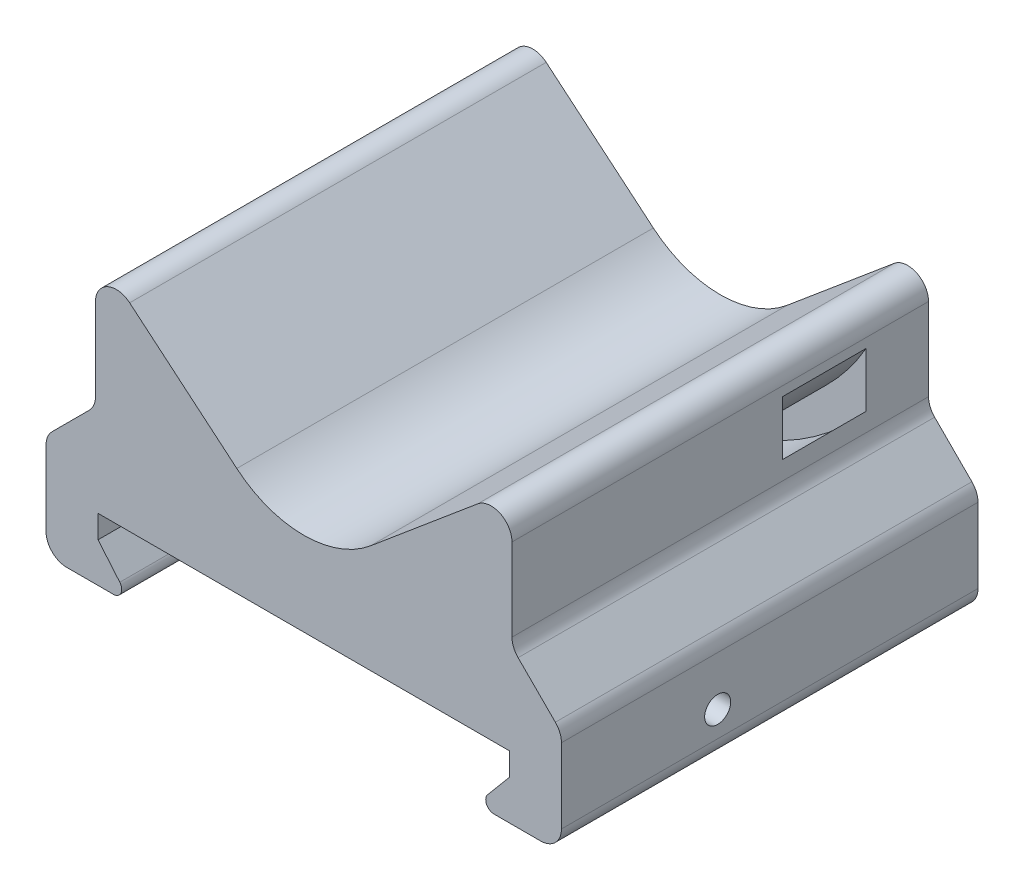
ISO-10303-21;
HEADER;
FILE_DESCRIPTION(('STEP AP214'),'2;1');
FILE_NAME('part.step','',(''),(''),'','','');
FILE_SCHEMA(('AUTOMOTIVE_DESIGN { 1 0 10303 214 1 1 1 1 }'));
ENDSEC;
DATA;
#1=APPLICATION_CONTEXT('core data for automotive mechanical design processes');
#2=APPLICATION_PROTOCOL_DEFINITION('international standard','automotive_design',2000,#1);
#3=PRODUCT_CONTEXT('',#1,'mechanical');
#4=PRODUCT('Part','Part','',(#3));
#5=PRODUCT_RELATED_PRODUCT_CATEGORY('part','',(#4));
#6=PRODUCT_DEFINITION_FORMATION('','',#4);
#7=PRODUCT_DEFINITION_CONTEXT('part definition',#1,'design');
#8=PRODUCT_DEFINITION('design','',#6,#7);
#9=PRODUCT_DEFINITION_SHAPE('','',#8);
#10=(LENGTH_UNIT() NAMED_UNIT(*) SI_UNIT(.MILLI.,.METRE.));
#11=(NAMED_UNIT(*) PLANE_ANGLE_UNIT() SI_UNIT($,.RADIAN.));
#12=(NAMED_UNIT(*) SI_UNIT($,.STERADIAN.) SOLID_ANGLE_UNIT());
#13=UNCERTAINTY_MEASURE_WITH_UNIT(LENGTH_MEASURE(1.E-05),#10,'distance_accuracy_value','');
#14=(GEOMETRIC_REPRESENTATION_CONTEXT(3) GLOBAL_UNCERTAINTY_ASSIGNED_CONTEXT((#13)) GLOBAL_UNIT_ASSIGNED_CONTEXT((#10,
#11,#12)) REPRESENTATION_CONTEXT('',''));
#15=CARTESIAN_POINT('',(0.,0.,0.));
#16=DIRECTION('',(0.,0.,1.));
#17=DIRECTION('',(1.,0.,0.));
#18=AXIS2_PLACEMENT_3D('',#15,#16,#17);
#19=CARTESIAN_POINT('',(-24.75,3.1715728752538,40.));
#20=DIRECTION('',(1.,0.,0.));
#21=DIRECTION('',(0.,1.,0.));
#22=AXIS2_PLACEMENT_3D('',#19,#20,#21);
#23=PLANE('',#22);
#24=DIRECTION('',(0.,-1.,0.));
#25=VECTOR('',#24,1.);
#26=CARTESIAN_POINT('',(-24.75,3.1715728752538,0.));
#27=LINE('',#26,#25);
#28=CARTESIAN_POINT('',(-24.75,3.1715728752538,0.));
#29=VERTEX_POINT('',#28);
#30=CARTESIAN_POINT('',(-24.75,-4.00000000000001,0.));
#31=VERTEX_POINT('',#30);
#32=EDGE_CURVE('E468',#29,#31,#27,.T.);
#33=ORIENTED_EDGE('',*,*,#32,.T.);
#34=DIRECTION('',(0.,0.,-1.));
#35=VECTOR('',#34,1.);
#36=CARTESIAN_POINT('',(-24.75,-4.00000000000001,40.));
#37=LINE('',#36,#35);
#38=CARTESIAN_POINT('',(-24.75,-4.00000000000001,40.));
#39=VERTEX_POINT('',#38);
#40=EDGE_CURVE('E272',#39,#31,#37,.T.);
#41=ORIENTED_EDGE('',*,*,#40,.F.);
#42=DIRECTION('',(0.,-1.,0.));
#43=VECTOR('',#42,1.);
#44=CARTESIAN_POINT('',(-24.75,3.1715728752538,40.));
#45=LINE('',#44,#43);
#46=CARTESIAN_POINT('',(-24.75,3.1715728752538,40.));
#47=VERTEX_POINT('',#46);
#48=EDGE_CURVE('E416',#47,#39,#45,.T.);
#49=ORIENTED_EDGE('',*,*,#48,.F.);
#50=DIRECTION('',(0.,0.,-1.));
#51=VECTOR('',#50,1.);
#52=CARTESIAN_POINT('',(-24.75,3.1715728752538,40.));
#53=LINE('',#52,#51);
#54=EDGE_CURVE('E275',#47,#29,#53,.T.);
#55=ORIENTED_EDGE('',*,*,#54,.T.);
#56=EDGE_LOOP('',(#33,#41,#49,#55));
#57=FACE_BOUND('',#56,.T.);
#58=CARTESIAN_POINT('',(-24.75,-1.55554057263178,25.));
#59=DIRECTION('',(-1.,0.,0.));
#60=DIRECTION('',(0.,0.,1.));
#61=AXIS2_PLACEMENT_3D('',#58,#59,#60);
#62=CIRCLE('',#61,1.525);
#63=CARTESIAN_POINT('',(-24.75,-1.55554057263178,26.525));
#64=VERTEX_POINT('',#63);
#65=EDGE_CURVE('E844',#64,#64,#62,.T.);
#66=ORIENTED_EDGE('',*,*,#65,.F.);
#67=EDGE_LOOP('',(#66));
#68=FACE_BOUND('',#67,.T.);
#69=ADVANCED_FACE('F35',(#57,#68),#23,.F.);
#70=CARTESIAN_POINT('',(19.75,-2.2,40.));
#71=DIRECTION('',(1.,0.,0.));
#72=DIRECTION('',(0.,0.,-1.));
#73=AXIS2_PLACEMENT_3D('',#70,#71,#72);
#74=PLANE('',#73);
#75=DIRECTION('',(0.,0.,-1.));
#76=VECTOR('',#75,1.);
#77=CARTESIAN_POINT('',(19.75,-2.2,40.));
#78=LINE('',#77,#76);
#79=CARTESIAN_POINT('',(19.75,-2.2,23.9289388222533));
#80=VERTEX_POINT('',#79);
#81=CARTESIAN_POINT('',(19.75,-2.2,0.));
#82=VERTEX_POINT('',#81);
#83=EDGE_CURVE('E329',#80,#82,#78,.T.);
#84=ORIENTED_EDGE('',*,*,#83,.F.);
#85=CARTESIAN_POINT('',(19.75,-1.55554057263178,25.));
#86=DIRECTION('',(1.,0.,0.));
#87=DIRECTION('',(0.,0.,-1.));
#88=AXIS2_PLACEMENT_3D('',#85,#86,#87);
#89=CIRCLE('',#88,1.24999999999999);
#90=CARTESIAN_POINT('',(19.75,-2.2,26.0710611777467));
#91=VERTEX_POINT('',#90);
#92=EDGE_CURVE('E49',#80,#91,#89,.T.);
#93=ORIENTED_EDGE('',*,*,#92,.T.);
#94=CARTESIAN_POINT('',(19.75,-2.2,40.));
#95=VERTEX_POINT('',#94);
#96=EDGE_CURVE('E330',#95,#91,#78,.T.);
#97=ORIENTED_EDGE('',*,*,#96,.F.);
#98=DIRECTION('',(0.,-1.,0.));
#99=VECTOR('',#98,1.);
#100=CARTESIAN_POINT('',(19.75,-2.2,40.));
#101=LINE('',#100,#99);
#102=CARTESIAN_POINT('',(19.75,0.,40.));
#103=VERTEX_POINT('',#102);
#104=EDGE_CURVE('E376',#103,#95,#101,.T.);
#105=ORIENTED_EDGE('',*,*,#104,.F.);
#106=DIRECTION('',(0.,0.,-1.));
#107=VECTOR('',#106,1.);
#108=CARTESIAN_POINT('',(19.75,0.,40.));
#109=LINE('',#108,#107);
#110=CARTESIAN_POINT('',(19.75,0.,0.));
#111=VERTEX_POINT('',#110);
#112=EDGE_CURVE('E429',#103,#111,#109,.T.);
#113=ORIENTED_EDGE('',*,*,#112,.T.);
#114=DIRECTION('',(0.,-1.,0.));
#115=VECTOR('',#114,1.);
#116=CARTESIAN_POINT('',(19.75,-2.2,0.));
#117=LINE('',#116,#115);
#118=EDGE_CURVE('E375',#111,#82,#117,.T.);
#119=ORIENTED_EDGE('',*,*,#118,.T.);
#120=EDGE_LOOP('',(#84,#93,#97,#105,#113,#119));
#121=FACE_BOUND('',#120,.T.);
#122=ADVANCED_FACE('F37',(#121),#74,.F.);
#123=CARTESIAN_POINT('',(17.6641913834388,-4.68576991225076,40.));
#124=DIRECTION('',(0.766044443118974,-0.642787609686544,0.));
#125=DIRECTION('',(0.642787609686544,0.766044443118974,0.));
#126=AXIS2_PLACEMENT_3D('',#123,#124,#125);
#127=PLANE('',#126);
#128=ORIENTED_EDGE('',*,*,#96,.T.);
#129=CARTESIAN_POINT('',(20.2907656678134,-1.55554057263178,25.));
#130=DIRECTION('',(0.766044443118974,-0.642787609686544,0.));
#131=DIRECTION('',(-0.642787609686544,-0.766044443118974,0.));
#132=AXIS2_PLACEMENT_3D('',#129,#130,#131);
#133=ELLIPSE('',#132,1.63175911166534,1.24999999999999);
#134=EDGE_CURVE('E252',#91,#80,#133,.T.);
#135=ORIENTED_EDGE('',*,*,#134,.T.);
#136=ORIENTED_EDGE('',*,*,#83,.T.);
#137=DIRECTION('',(-0.642787609686544,-0.766044443118974,0.));
#138=VECTOR('',#137,1.);
#139=CARTESIAN_POINT('',(17.6641913834388,-4.68576991225076,0.));
#140=LINE('',#139,#138);
#141=CARTESIAN_POINT('',(17.6641913834388,-4.68576991225076,0.));
#142=VERTEX_POINT('',#141);
#143=EDGE_CURVE('E432',#82,#142,#140,.T.);
#144=ORIENTED_EDGE('',*,*,#143,.T.);
#145=DIRECTION('',(0.,0.,-1.));
#146=VECTOR('',#145,1.);
#147=CARTESIAN_POINT('',(17.6641913834388,-4.68576991225076,40.));
#148=LINE('',#147,#146);
#149=CARTESIAN_POINT('',(17.6641913834388,-4.68576991225076,40.));
#150=VERTEX_POINT('',#149);
#151=EDGE_CURVE('E326',#150,#142,#148,.T.);
#152=ORIENTED_EDGE('',*,*,#151,.F.);
#153=DIRECTION('',(-0.642787609686544,-0.766044443118974,0.));
#154=VECTOR('',#153,1.);
#155=CARTESIAN_POINT('',(17.6641913834388,-4.68576991225076,40.));
#156=LINE('',#155,#154);
#157=EDGE_CURVE('E379',#95,#150,#156,.T.);
#158=ORIENTED_EDGE('',*,*,#157,.F.);
#159=EDGE_LOOP('',(#128,#135,#136,#144,#152,#158));
#160=FACE_BOUND('',#159,.T.);
#161=ADVANCED_FACE('F499',(#160),#127,.F.);
#162=CARTESIAN_POINT('',(18.277026937934,-5.2,40.));
#163=DIRECTION('',(0.,0.,-1.));
#164=DIRECTION('',(-1.,0.,0.));
#165=AXIS2_PLACEMENT_3D('',#162,#163,#164);
#166=CYLINDRICAL_SURFACE('',#165,0.800000000000002);
#167=CARTESIAN_POINT('',(18.277026937934,-5.2,0.));
#168=DIRECTION('',(0.,0.,1.));
#169=DIRECTION('',(-1.,0.,0.));
#170=AXIS2_PLACEMENT_3D('',#167,#168,#169);
#171=CIRCLE('',#170,0.800000000000002);
#172=CARTESIAN_POINT('',(18.277026937934,-6.,0.));
#173=VERTEX_POINT('',#172);
#174=EDGE_CURVE('E434',#142,#173,#171,.T.);
#175=ORIENTED_EDGE('',*,*,#174,.T.);
#176=DIRECTION('',(0.,0.,-1.));
#177=VECTOR('',#176,1.);
#178=CARTESIAN_POINT('',(18.277026937934,-6.,40.));
#179=LINE('',#178,#177);
#180=CARTESIAN_POINT('',(18.277026937934,-6.,40.));
#181=VERTEX_POINT('',#180);
#182=EDGE_CURVE('E323',#181,#173,#179,.T.);
#183=ORIENTED_EDGE('',*,*,#182,.F.);
#184=CARTESIAN_POINT('',(18.277026937934,-5.2,40.));
#185=DIRECTION('',(0.,0.,1.));
#186=DIRECTION('',(-1.,0.,0.));
#187=AXIS2_PLACEMENT_3D('',#184,#185,#186);
#188=CIRCLE('',#187,0.800000000000002);
#189=EDGE_CURVE('E382',#150,#181,#188,.T.);
#190=ORIENTED_EDGE('',*,*,#189,.F.);
#191=ORIENTED_EDGE('',*,*,#151,.T.);
#192=EDGE_LOOP('',(#175,#183,#190,#191));
#193=FACE_BOUND('',#192,.T.);
#194=ADVANCED_FACE('F595',(#193),#166,.T.);
#195=CARTESIAN_POINT('',(22.75,-6.,40.));
#196=DIRECTION('',(0.,1.,0.));
#197=DIRECTION('',(-1.,0.,0.));
#198=AXIS2_PLACEMENT_3D('',#195,#196,#197);
#199=PLANE('',#198);
#200=DIRECTION('',(1.,0.,0.));
#201=VECTOR('',#200,1.);
#202=CARTESIAN_POINT('',(22.75,-6.,0.));
#203=LINE('',#202,#201);
#204=CARTESIAN_POINT('',(22.75,-6.,0.));
#205=VERTEX_POINT('',#204);
#206=EDGE_CURVE('E436',#173,#205,#203,.T.);
#207=ORIENTED_EDGE('',*,*,#206,.T.);
#208=DIRECTION('',(0.,0.,-1.));
#209=VECTOR('',#208,1.);
#210=CARTESIAN_POINT('',(22.75,-6.,40.));
#211=LINE('',#210,#209);
#212=CARTESIAN_POINT('',(22.75,-6.,40.));
#213=VERTEX_POINT('',#212);
#214=EDGE_CURVE('E320',#213,#205,#211,.T.);
#215=ORIENTED_EDGE('',*,*,#214,.F.);
#216=DIRECTION('',(1.,0.,0.));
#217=VECTOR('',#216,1.);
#218=CARTESIAN_POINT('',(22.75,-6.,40.));
#219=LINE('',#218,#217);
#220=EDGE_CURVE('E384',#181,#213,#219,.T.);
#221=ORIENTED_EDGE('',*,*,#220,.F.);
#222=ORIENTED_EDGE('',*,*,#182,.T.);
#223=EDGE_LOOP('',(#207,#215,#221,#222));
#224=FACE_BOUND('',#223,.T.);
#225=ADVANCED_FACE('F591',(#224),#199,.F.);
#226=CARTESIAN_POINT('',(22.75,-4.,40.));
#227=DIRECTION('',(0.,0.,-1.));
#228=DIRECTION('',(-1.,0.,0.));
#229=AXIS2_PLACEMENT_3D('',#226,#227,#228);
#230=CYLINDRICAL_SURFACE('',#229,2.);
#231=CARTESIAN_POINT('',(22.75,-4.,0.));
#232=DIRECTION('',(0.,0.,1.));
#233=DIRECTION('',(-1.,0.,0.));
#234=AXIS2_PLACEMENT_3D('',#231,#232,#233);
#235=CIRCLE('',#234,2.);
#236=CARTESIAN_POINT('',(24.75,-4.,0.));
#237=VERTEX_POINT('',#236);
#238=EDGE_CURVE('E438',#205,#237,#235,.T.);
#239=ORIENTED_EDGE('',*,*,#238,.T.);
#240=DIRECTION('',(0.,0.,-1.));
#241=VECTOR('',#240,1.);
#242=CARTESIAN_POINT('',(24.75,-4.,40.));
#243=LINE('',#242,#241);
#244=CARTESIAN_POINT('',(24.75,-4.,40.));
#245=VERTEX_POINT('',#244);
#246=EDGE_CURVE('E317',#245,#237,#243,.T.);
#247=ORIENTED_EDGE('',*,*,#246,.F.);
#248=CARTESIAN_POINT('',(22.75,-4.,40.));
#249=DIRECTION('',(0.,0.,1.));
#250=DIRECTION('',(-1.,0.,0.));
#251=AXIS2_PLACEMENT_3D('',#248,#249,#250);
#252=CIRCLE('',#251,2.);
#253=EDGE_CURVE('E386',#213,#245,#252,.T.);
#254=ORIENTED_EDGE('',*,*,#253,.F.);
#255=ORIENTED_EDGE('',*,*,#214,.T.);
#256=EDGE_LOOP('',(#239,#247,#254,#255));
#257=FACE_BOUND('',#256,.T.);
#258=ADVANCED_FACE('F587',(#257),#230,.T.);
#259=CARTESIAN_POINT('',(24.75,3.17157287525381,40.));
#260=DIRECTION('',(-1.,0.,0.));
#261=DIRECTION('',(0.,-1.,0.));
#262=AXIS2_PLACEMENT_3D('',#259,#260,#261);
#263=PLANE('',#262);
#264=CARTESIAN_POINT('',(24.75,-1.55554057263178,25.));
#265=DIRECTION('',(-1.,0.,0.));
#266=DIRECTION('',(0.,0.,1.));
#267=AXIS2_PLACEMENT_3D('',#264,#265,#266);
#268=CIRCLE('',#267,1.24999999999999);
#269=CARTESIAN_POINT('',(24.75,-1.55554057263178,26.25));
#270=VERTEX_POINT('',#269);
#271=EDGE_CURVE('E253',#270,#270,#268,.T.);
#272=ORIENTED_EDGE('',*,*,#271,.T.);
#273=EDGE_LOOP('',(#272));
#274=FACE_BOUND('',#273,.T.);
#275=DIRECTION('',(0.,1.,0.));
#276=VECTOR('',#275,1.);
#277=CARTESIAN_POINT('',(24.75,3.17157287525381,0.));
#278=LINE('',#277,#276);
#279=CARTESIAN_POINT('',(24.75,3.17157287525381,0.));
#280=VERTEX_POINT('',#279);
#281=EDGE_CURVE('E440',#237,#280,#278,.T.);
#282=ORIENTED_EDGE('',*,*,#281,.T.);
#283=DIRECTION('',(0.,0.,-1.));
#284=VECTOR('',#283,1.);
#285=CARTESIAN_POINT('',(24.75,3.17157287525381,40.));
#286=LINE('',#285,#284);
#287=CARTESIAN_POINT('',(24.75,3.17157287525381,40.));
#288=VERTEX_POINT('',#287);
#289=EDGE_CURVE('E314',#288,#280,#286,.T.);
#290=ORIENTED_EDGE('',*,*,#289,.F.);
#291=DIRECTION('',(0.,1.,0.));
#292=VECTOR('',#291,1.);
#293=CARTESIAN_POINT('',(24.75,3.17157287525381,40.));
#294=LINE('',#293,#292);
#295=EDGE_CURVE('E388',#245,#288,#294,.T.);
#296=ORIENTED_EDGE('',*,*,#295,.F.);
#297=ORIENTED_EDGE('',*,*,#246,.T.);
#298=EDGE_LOOP('',(#282,#290,#296,#297));
#299=FACE_BOUND('',#298,.T.);
#300=ADVANCED_FACE('F583',(#274,#299),#263,.F.);
#301=CARTESIAN_POINT('',(22.75,3.17157287525381,40.));
#302=DIRECTION('',(0.,0.,-1.));
#303=DIRECTION('',(-1.,0.,0.));
#304=AXIS2_PLACEMENT_3D('',#301,#302,#303);
#305=CYLINDRICAL_SURFACE('',#304,2.);
#306=CARTESIAN_POINT('',(22.75,3.17157287525381,0.));
#307=DIRECTION('',(0.,0.,1.));
#308=DIRECTION('',(-1.,0.,0.));
#309=AXIS2_PLACEMENT_3D('',#306,#307,#308);
#310=CIRCLE('',#309,2.);
#311=CARTESIAN_POINT('',(24.1642135623731,4.58578643762691,0.));
#312=VERTEX_POINT('',#311);
#313=EDGE_CURVE('E442',#280,#312,#310,.T.);
#314=ORIENTED_EDGE('',*,*,#313,.T.);
#315=DIRECTION('',(0.,0.,-1.));
#316=VECTOR('',#315,1.);
#317=CARTESIAN_POINT('',(24.1642135623731,4.58578643762691,40.));
#318=LINE('',#317,#316);
#319=CARTESIAN_POINT('',(24.1642135623731,4.58578643762691,40.));
#320=VERTEX_POINT('',#319);
#321=EDGE_CURVE('E311',#320,#312,#318,.T.);
#322=ORIENTED_EDGE('',*,*,#321,.F.);
#323=CARTESIAN_POINT('',(22.75,3.17157287525381,40.));
#324=DIRECTION('',(0.,0.,1.));
#325=DIRECTION('',(-1.,0.,0.));
#326=AXIS2_PLACEMENT_3D('',#323,#324,#325);
#327=CIRCLE('',#326,2.);
#328=EDGE_CURVE('E390',#288,#320,#327,.T.);
#329=ORIENTED_EDGE('',*,*,#328,.F.);
#330=ORIENTED_EDGE('',*,*,#289,.T.);
#331=EDGE_LOOP('',(#314,#322,#329,#330));
#332=FACE_BOUND('',#331,.T.);
#333=ADVANCED_FACE('F579',(#332),#305,.T.);
#334=CARTESIAN_POINT('',(20.5857864376269,8.16421356237308,40.));
#335=DIRECTION('',(-0.707106781186546,-0.70710678118655,0.));
#336=DIRECTION('',(0.70710678118655,-0.707106781186546,0.));
#337=AXIS2_PLACEMENT_3D('',#334,#335,#336);
#338=PLANE('',#337);
#339=DIRECTION('',(-0.707106781186549,0.707106781186545,0.));
#340=VECTOR('',#339,1.);
#341=CARTESIAN_POINT('',(20.5857864376269,8.16421356237308,0.));
#342=LINE('',#341,#340);
#343=CARTESIAN_POINT('',(20.5857864376269,8.16421356237308,0.));
#344=VERTEX_POINT('',#343);
#345=EDGE_CURVE('E444',#312,#344,#342,.T.);
#346=ORIENTED_EDGE('',*,*,#345,.T.);
#347=DIRECTION('',(0.,0.,-1.));
#348=VECTOR('',#347,1.);
#349=CARTESIAN_POINT('',(20.5857864376269,8.16421356237308,40.));
#350=LINE('',#349,#348);
#351=CARTESIAN_POINT('',(20.5857864376269,8.16421356237308,40.));
#352=VERTEX_POINT('',#351);
#353=EDGE_CURVE('E308',#352,#344,#350,.T.);
#354=ORIENTED_EDGE('',*,*,#353,.F.);
#355=DIRECTION('',(-0.707106781186549,0.707106781186545,0.));
#356=VECTOR('',#355,1.);
#357=CARTESIAN_POINT('',(20.5857864376269,8.16421356237308,40.));
#358=LINE('',#357,#356);
#359=EDGE_CURVE('E392',#320,#352,#358,.T.);
#360=ORIENTED_EDGE('',*,*,#359,.F.);
#361=ORIENTED_EDGE('',*,*,#321,.T.);
#362=EDGE_LOOP('',(#346,#354,#360,#361));
#363=FACE_BOUND('',#362,.T.);
#364=ADVANCED_FACE('F575',(#363),#338,.F.);
#365=CARTESIAN_POINT('',(22.,9.57842712474618,40.));
#366=DIRECTION('',(0.,0.,-1.));
#367=DIRECTION('',(-1.,0.,0.));
#368=AXIS2_PLACEMENT_3D('',#365,#366,#367);
#369=CYLINDRICAL_SURFACE('',#368,2.);
#370=CARTESIAN_POINT('',(22.,9.57842712474618,0.));
#371=DIRECTION('',(0.,0.,-1.));
#372=DIRECTION('',(1.,0.,0.));
#373=AXIS2_PLACEMENT_3D('',#370,#371,#372);
#374=CIRCLE('',#373,2.);
#375=CARTESIAN_POINT('',(20.,9.57842712474618,0.));
#376=VERTEX_POINT('',#375);
#377=EDGE_CURVE('E446',#344,#376,#374,.T.);
#378=ORIENTED_EDGE('',*,*,#377,.T.);
#379=DIRECTION('',(0.,0.,-1.));
#380=VECTOR('',#379,1.);
#381=CARTESIAN_POINT('',(20.,9.57842712474618,40.));
#382=LINE('',#381,#380);
#383=CARTESIAN_POINT('',(20.,9.57842712474618,40.));
#384=VERTEX_POINT('',#383);
#385=EDGE_CURVE('E305',#384,#376,#382,.T.);
#386=ORIENTED_EDGE('',*,*,#385,.F.);
#387=CARTESIAN_POINT('',(22.,9.57842712474618,40.));
#388=DIRECTION('',(0.,0.,-1.));
#389=DIRECTION('',(1.,0.,0.));
#390=AXIS2_PLACEMENT_3D('',#387,#388,#389);
#391=CIRCLE('',#390,2.);
#392=EDGE_CURVE('E394',#352,#384,#391,.T.);
#393=ORIENTED_EDGE('',*,*,#392,.F.);
#394=ORIENTED_EDGE('',*,*,#353,.T.);
#395=EDGE_LOOP('',(#378,#386,#393,#394));
#396=FACE_BOUND('',#395,.T.);
#397=ADVANCED_FACE('F572',(#396),#369,.F.);
#398=CARTESIAN_POINT('',(20.,17.4929787825266,40.));
#399=DIRECTION('',(-1.,0.,0.));
#400=DIRECTION('',(0.,0.,1.));
#401=AXIS2_PLACEMENT_3D('',#398,#399,#400);
#402=PLANE('',#401);
#403=DIRECTION('',(0.,0.,1.));
#404=VECTOR('',#403,1.);
#405=CARTESIAN_POINT('',(20.,16.5871519042062,29.3538484245368));
#406=LINE('',#405,#404);
#407=CARTESIAN_POINT('',(20.,16.5871519042062,14.));
#408=VERTEX_POINT('',#407);
#409=CARTESIAN_POINT('',(20.,16.5871519042062,6.));
#410=VERTEX_POINT('',#409);
#411=EDGE_CURVE('E360',#408,#410,#406,.F.);
#412=ORIENTED_EDGE('',*,*,#411,.T.);
#413=DIRECTION('',(0.,-1.,0.));
#414=VECTOR('',#413,1.);
#415=CARTESIAN_POINT('',(20.,17.4929787825266,6.));
#416=LINE('',#415,#414);
#417=CARTESIAN_POINT('',(20.,11.3563271074217,6.));
#418=VERTEX_POINT('',#417);
#419=EDGE_CURVE('E373',#410,#418,#416,.T.);
#420=ORIENTED_EDGE('',*,*,#419,.T.);
#421=DIRECTION('',(0.,0.,1.));
#422=VECTOR('',#421,1.);
#423=CARTESIAN_POINT('',(20.,11.3563271074217,29.3538484245368));
#424=LINE('',#423,#422);
#425=CARTESIAN_POINT('',(20.,11.3563271074217,14.));
#426=VERTEX_POINT('',#425);
#427=EDGE_CURVE('E359',#418,#426,#424,.T.);
#428=ORIENTED_EDGE('',*,*,#427,.T.);
#429=DIRECTION('',(0.,1.,0.));
#430=VECTOR('',#429,1.);
#431=CARTESIAN_POINT('',(20.,17.4929787825266,14.));
#432=LINE('',#431,#430);
#433=EDGE_CURVE('E364',#426,#408,#432,.T.);
#434=ORIENTED_EDGE('',*,*,#433,.T.);
#435=EDGE_LOOP('',(#412,#420,#428,#434));
#436=FACE_BOUND('',#435,.T.);
#437=DIRECTION('',(0.,1.,0.));
#438=VECTOR('',#437,1.);
#439=CARTESIAN_POINT('',(20.,17.4929787825266,0.));
#440=LINE('',#439,#438);
#441=CARTESIAN_POINT('',(20.,17.4929787825266,0.));
#442=VERTEX_POINT('',#441);
#443=EDGE_CURVE('E448',#376,#442,#440,.T.);
#444=ORIENTED_EDGE('',*,*,#443,.T.);
#445=DIRECTION('',(0.,0.,-1.));
#446=VECTOR('',#445,1.);
#447=CARTESIAN_POINT('',(20.,17.4929787825266,40.));
#448=LINE('',#447,#446);
#449=CARTESIAN_POINT('',(20.,17.4929787825266,40.));
#450=VERTEX_POINT('',#449);
#451=EDGE_CURVE('E302',#450,#442,#448,.T.);
#452=ORIENTED_EDGE('',*,*,#451,.F.);
#453=DIRECTION('',(0.,1.,0.));
#454=VECTOR('',#453,1.);
#455=CARTESIAN_POINT('',(20.,17.4929787825266,40.));
#456=LINE('',#455,#454);
#457=EDGE_CURVE('E396',#384,#450,#456,.T.);
#458=ORIENTED_EDGE('',*,*,#457,.F.);
#459=ORIENTED_EDGE('',*,*,#385,.T.);
#460=EDGE_LOOP('',(#444,#452,#458,#459));
#461=FACE_BOUND('',#460,.T.);
#462=ADVANCED_FACE('F511',(#436,#461),#402,.F.);
#463=CARTESIAN_POINT('',(18.,17.4929787825266,40.));
#464=DIRECTION('',(0.,0.,-1.));
#465=DIRECTION('',(-1.,0.,0.));
#466=AXIS2_PLACEMENT_3D('',#463,#464,#465);
#467=CYLINDRICAL_SURFACE('',#466,2.);
#468=CARTESIAN_POINT('',(18.,17.4929787825266,0.));
#469=DIRECTION('',(0.,0.,1.));
#470=DIRECTION('',(-1.,0.,0.));
#471=AXIS2_PLACEMENT_3D('',#468,#469,#470);
#472=CIRCLE('',#471,2.);
#473=CARTESIAN_POINT('',(16.7144247806269,19.0250676687646,0.));
#474=VERTEX_POINT('',#473);
#475=EDGE_CURVE('E450',#442,#474,#472,.T.);
#476=ORIENTED_EDGE('',*,*,#475,.T.);
#477=DIRECTION('',(0.,0.,-1.));
#478=VECTOR('',#477,1.);
#479=CARTESIAN_POINT('',(16.7144247806269,19.0250676687646,40.));
#480=LINE('',#479,#478);
#481=CARTESIAN_POINT('',(16.7144247806269,19.0250676687646,40.));
#482=VERTEX_POINT('',#481);
#483=EDGE_CURVE('E299',#482,#474,#480,.T.);
#484=ORIENTED_EDGE('',*,*,#483,.F.);
#485=CARTESIAN_POINT('',(18.,17.4929787825266,40.));
#486=DIRECTION('',(0.,0.,1.));
#487=DIRECTION('',(-1.,0.,0.));
#488=AXIS2_PLACEMENT_3D('',#485,#486,#487);
#489=CIRCLE('',#488,2.);
#490=EDGE_CURVE('E398',#450,#482,#489,.T.);
#491=ORIENTED_EDGE('',*,*,#490,.F.);
#492=ORIENTED_EDGE('',*,*,#451,.T.);
#493=EDGE_LOOP('',(#476,#484,#491,#492));
#494=FACE_BOUND('',#493,.T.);
#495=ADVANCED_FACE('F565',(#494),#467,.T.);
#496=CARTESIAN_POINT('',(6.42787609686544,10.3936284621331,40.));
#497=DIRECTION('',(0.642787609686544,-0.766044443118974,0.));
#498=DIRECTION('',(0.766044443118974,0.642787609686544,0.));
#499=AXIS2_PLACEMENT_3D('',#496,#497,#498);
#500=PLANE('',#499);
#501=DIRECTION('',(-0.766044443118974,-0.642787609686544,0.));
#502=VECTOR('',#501,1.);
#503=CARTESIAN_POINT('',(6.42787609686544,10.3936284621331,0.));
#504=LINE('',#503,#502);
#505=CARTESIAN_POINT('',(6.42787609686544,10.3936284621331,0.));
#506=VERTEX_POINT('',#505);
#507=EDGE_CURVE('E452',#474,#506,#504,.T.);
#508=ORIENTED_EDGE('',*,*,#507,.T.);
#509=DIRECTION('',(0.,0.,-1.));
#510=VECTOR('',#509,1.);
#511=CARTESIAN_POINT('',(6.42787609686544,10.3936284621331,40.));
#512=LINE('',#511,#510);
#513=CARTESIAN_POINT('',(6.42787609686544,10.3936284621331,40.));
#514=VERTEX_POINT('',#513);
#515=EDGE_CURVE('E296',#514,#506,#512,.T.);
#516=ORIENTED_EDGE('',*,*,#515,.F.);
#517=DIRECTION('',(-0.766044443118974,-0.642787609686544,0.));
#518=VECTOR('',#517,1.);
#519=CARTESIAN_POINT('',(6.42787609686544,10.3936284621331,40.));
#520=LINE('',#519,#518);
#521=EDGE_CURVE('E400',#482,#514,#520,.T.);
#522=ORIENTED_EDGE('',*,*,#521,.F.);
#523=ORIENTED_EDGE('',*,*,#483,.T.);
#524=EDGE_LOOP('',(#508,#516,#522,#523));
#525=FACE_BOUND('',#524,.T.);
#526=ADVANCED_FACE('F561',(#525),#500,.F.);
#527=CARTESIAN_POINT('',(0.,18.0540728933228,40.));
#528=DIRECTION('',(0.,0.,-1.));
#529=DIRECTION('',(-1.,0.,0.));
#530=AXIS2_PLACEMENT_3D('',#527,#528,#529);
#531=CYLINDRICAL_SURFACE('',#530,10.);
#532=CARTESIAN_POINT('',(0.,18.0540728933228,0.));
#533=DIRECTION('',(0.,0.,-1.));
#534=DIRECTION('',(1.,0.,0.));
#535=AXIS2_PLACEMENT_3D('',#532,#533,#534);
#536=CIRCLE('',#535,10.);
#537=CARTESIAN_POINT('',(-6.42787609686544,10.3936284621331,0.));
#538=VERTEX_POINT('',#537);
#539=EDGE_CURVE('E454',#506,#538,#536,.T.);
#540=ORIENTED_EDGE('',*,*,#539,.T.);
#541=DIRECTION('',(0.,0.,-1.));
#542=VECTOR('',#541,1.);
#543=CARTESIAN_POINT('',(-6.42787609686544,10.3936284621331,40.));
#544=LINE('',#543,#542);
#545=CARTESIAN_POINT('',(-6.42787609686544,10.3936284621331,40.));
#546=VERTEX_POINT('',#545);
#547=EDGE_CURVE('E293',#546,#538,#544,.T.);
#548=ORIENTED_EDGE('',*,*,#547,.F.);
#549=CARTESIAN_POINT('',(0.,18.0540728933228,40.));
#550=DIRECTION('',(0.,0.,-1.));
#551=DIRECTION('',(1.,0.,0.));
#552=AXIS2_PLACEMENT_3D('',#549,#550,#551);
#553=CIRCLE('',#552,10.);
#554=EDGE_CURVE('E402',#514,#546,#553,.T.);
#555=ORIENTED_EDGE('',*,*,#554,.F.);
#556=ORIENTED_EDGE('',*,*,#515,.T.);
#557=EDGE_LOOP('',(#540,#548,#555,#556));
#558=FACE_BOUND('',#557,.T.);
#559=ADVANCED_FACE('F557',(#558),#531,.F.);
#560=CARTESIAN_POINT('',(-6.42787609686544,10.3936284621331,40.));
#561=DIRECTION('',(-0.642787609686544,-0.766044443118974,0.));
#562=DIRECTION('',(0.766044443118974,-0.642787609686544,0.));
#563=AXIS2_PLACEMENT_3D('',#560,#561,#562);
#564=PLANE('',#563);
#565=DIRECTION('',(-0.766044443118974,0.642787609686544,0.));
#566=VECTOR('',#565,1.);
#567=CARTESIAN_POINT('',(-6.42787609686544,10.3936284621331,0.));
#568=LINE('',#567,#566);
#569=CARTESIAN_POINT('',(-16.7144247806269,19.0250676687646,0.));
#570=VERTEX_POINT('',#569);
#571=EDGE_CURVE('E456',#538,#570,#568,.T.);
#572=ORIENTED_EDGE('',*,*,#571,.T.);
#573=DIRECTION('',(0.,0.,-1.));
#574=VECTOR('',#573,1.);
#575=CARTESIAN_POINT('',(-16.7144247806269,19.0250676687646,40.));
#576=LINE('',#575,#574);
#577=CARTESIAN_POINT('',(-16.7144247806269,19.0250676687646,40.));
#578=VERTEX_POINT('',#577);
#579=EDGE_CURVE('E290',#578,#570,#576,.T.);
#580=ORIENTED_EDGE('',*,*,#579,.F.);
#581=DIRECTION('',(-0.766044443118974,0.642787609686544,0.));
#582=VECTOR('',#581,1.);
#583=CARTESIAN_POINT('',(-6.42787609686544,10.3936284621331,40.));
#584=LINE('',#583,#582);
#585=EDGE_CURVE('E404',#546,#578,#584,.T.);
#586=ORIENTED_EDGE('',*,*,#585,.F.);
#587=ORIENTED_EDGE('',*,*,#547,.T.);
#588=EDGE_LOOP('',(#572,#580,#586,#587));
#589=FACE_BOUND('',#588,.T.);
#590=ADVANCED_FACE('F553',(#589),#564,.F.);
#591=CARTESIAN_POINT('',(-18.,17.4929787825266,40.));
#592=DIRECTION('',(0.,0.,-1.));
#593=DIRECTION('',(-1.,0.,0.));
#594=AXIS2_PLACEMENT_3D('',#591,#592,#593);
#595=CYLINDRICAL_SURFACE('',#594,2.);
#596=CARTESIAN_POINT('',(-18.,17.4929787825266,0.));
#597=DIRECTION('',(0.,0.,1.));
#598=DIRECTION('',(-1.,0.,0.));
#599=AXIS2_PLACEMENT_3D('',#596,#597,#598);
#600=CIRCLE('',#599,2.);
#601=CARTESIAN_POINT('',(-20.,17.4929787825266,0.));
#602=VERTEX_POINT('',#601);
#603=EDGE_CURVE('E458',#570,#602,#600,.T.);
#604=ORIENTED_EDGE('',*,*,#603,.T.);
#605=DIRECTION('',(0.,0.,-1.));
#606=VECTOR('',#605,1.);
#607=CARTESIAN_POINT('',(-20.,17.4929787825266,40.));
#608=LINE('',#607,#606);
#609=CARTESIAN_POINT('',(-20.,17.4929787825266,40.));
#610=VERTEX_POINT('',#609);
#611=EDGE_CURVE('E287',#610,#602,#608,.T.);
#612=ORIENTED_EDGE('',*,*,#611,.F.);
#613=CARTESIAN_POINT('',(-18.,17.4929787825266,40.));
#614=DIRECTION('',(0.,0.,1.));
#615=DIRECTION('',(-1.,0.,0.));
#616=AXIS2_PLACEMENT_3D('',#613,#614,#615);
#617=CIRCLE('',#616,2.);
#618=EDGE_CURVE('E406',#578,#610,#617,.T.);
#619=ORIENTED_EDGE('',*,*,#618,.F.);
#620=ORIENTED_EDGE('',*,*,#579,.T.);
#621=EDGE_LOOP('',(#604,#612,#619,#620));
#622=FACE_BOUND('',#621,.T.);
#623=ADVANCED_FACE('F550',(#622),#595,.T.);
#624=CARTESIAN_POINT('',(-20.,17.4929787825266,40.));
#625=DIRECTION('',(1.,0.,0.));
#626=DIRECTION('',(0.,0.,-1.));
#627=AXIS2_PLACEMENT_3D('',#624,#625,#626);
#628=PLANE('',#627);
#629=DIRECTION('',(0.,0.,1.));
#630=VECTOR('',#629,1.);
#631=CARTESIAN_POINT('',(-20.,11.3563271074217,29.3538484245368));
#632=LINE('',#631,#630);
#633=CARTESIAN_POINT('',(-20.,11.3563271074217,14.));
#634=VERTEX_POINT('',#633);
#635=CARTESIAN_POINT('',(-20.,11.3563271074217,6.));
#636=VERTEX_POINT('',#635);
#637=EDGE_CURVE('E339',#634,#636,#632,.F.);
#638=ORIENTED_EDGE('',*,*,#637,.T.);
#639=DIRECTION('',(0.,1.,0.));
#640=VECTOR('',#639,1.);
#641=CARTESIAN_POINT('',(-20.,17.4929787825266,6.));
#642=LINE('',#641,#640);
#643=CARTESIAN_POINT('',(-20.,16.5871519042062,6.));
#644=VERTEX_POINT('',#643);
#645=EDGE_CURVE('E43',#636,#644,#642,.T.);
#646=ORIENTED_EDGE('',*,*,#645,.T.);
#647=DIRECTION('',(0.,0.,1.));
#648=VECTOR('',#647,1.);
#649=CARTESIAN_POINT('',(-20.,16.5871519042062,29.3538484245368));
#650=LINE('',#649,#648);
#651=CARTESIAN_POINT('',(-20.,16.5871519042062,14.));
#652=VERTEX_POINT('',#651);
#653=EDGE_CURVE('E333',#644,#652,#650,.T.);
#654=ORIENTED_EDGE('',*,*,#653,.T.);
#655=DIRECTION('',(0.,-1.,0.));
#656=VECTOR('',#655,1.);
#657=CARTESIAN_POINT('',(-20.,17.4929787825266,14.));
#658=LINE('',#657,#656);
#659=EDGE_CURVE('E336',#652,#634,#658,.T.);
#660=ORIENTED_EDGE('',*,*,#659,.T.);
#661=EDGE_LOOP('',(#638,#646,#654,#660));
#662=FACE_BOUND('',#661,.T.);
#663=DIRECTION('',(0.,-1.,0.));
#664=VECTOR('',#663,1.);
#665=CARTESIAN_POINT('',(-20.,17.4929787825266,0.));
#666=LINE('',#665,#664);
#667=CARTESIAN_POINT('',(-20.,9.57842712474617,0.));
#668=VERTEX_POINT('',#667);
#669=EDGE_CURVE('E460',#602,#668,#666,.T.);
#670=ORIENTED_EDGE('',*,*,#669,.T.);
#671=DIRECTION('',(0.,0.,-1.));
#672=VECTOR('',#671,1.);
#673=CARTESIAN_POINT('',(-20.,9.57842712474617,40.));
#674=LINE('',#673,#672);
#675=CARTESIAN_POINT('',(-20.,9.57842712474617,40.));
#676=VERTEX_POINT('',#675);
#677=EDGE_CURVE('E284',#676,#668,#674,.T.);
#678=ORIENTED_EDGE('',*,*,#677,.F.);
#679=DIRECTION('',(0.,-1.,0.));
#680=VECTOR('',#679,1.);
#681=CARTESIAN_POINT('',(-20.,17.4929787825266,40.));
#682=LINE('',#681,#680);
#683=EDGE_CURVE('E408',#610,#676,#682,.T.);
#684=ORIENTED_EDGE('',*,*,#683,.F.);
#685=ORIENTED_EDGE('',*,*,#611,.T.);
#686=EDGE_LOOP('',(#670,#678,#684,#685));
#687=FACE_BOUND('',#686,.T.);
#688=ADVANCED_FACE('F343',(#662,#687),#628,.F.);
#689=CARTESIAN_POINT('',(-22.,9.57842712474617,40.));
#690=DIRECTION('',(0.,0.,-1.));
#691=DIRECTION('',(-1.,0.,0.));
#692=AXIS2_PLACEMENT_3D('',#689,#690,#691);
#693=CYLINDRICAL_SURFACE('',#692,2.);
#694=CARTESIAN_POINT('',(-22.,9.57842712474617,0.));
#695=DIRECTION('',(0.,0.,-1.));
#696=DIRECTION('',(1.,0.,0.));
#697=AXIS2_PLACEMENT_3D('',#694,#695,#696);
#698=CIRCLE('',#697,2.);
#699=CARTESIAN_POINT('',(-20.5857864376269,8.16421356237307,0.));
#700=VERTEX_POINT('',#699);
#701=EDGE_CURVE('E462',#668,#700,#698,.T.);
#702=ORIENTED_EDGE('',*,*,#701,.T.);
#703=DIRECTION('',(0.,0.,-1.));
#704=VECTOR('',#703,1.);
#705=CARTESIAN_POINT('',(-20.5857864376269,8.16421356237307,40.));
#706=LINE('',#705,#704);
#707=CARTESIAN_POINT('',(-20.5857864376269,8.16421356237307,40.));
#708=VERTEX_POINT('',#707);
#709=EDGE_CURVE('E281',#708,#700,#706,.T.);
#710=ORIENTED_EDGE('',*,*,#709,.F.);
#711=CARTESIAN_POINT('',(-22.,9.57842712474617,40.));
#712=DIRECTION('',(0.,0.,-1.));
#713=DIRECTION('',(1.,0.,0.));
#714=AXIS2_PLACEMENT_3D('',#711,#712,#713);
#715=CIRCLE('',#714,2.);
#716=EDGE_CURVE('E410',#676,#708,#715,.T.);
#717=ORIENTED_EDGE('',*,*,#716,.F.);
#718=ORIENTED_EDGE('',*,*,#677,.T.);
#719=EDGE_LOOP('',(#702,#710,#717,#718));
#720=FACE_BOUND('',#719,.T.);
#721=ADVANCED_FACE('F543',(#720),#693,.F.);
#722=CARTESIAN_POINT('',(-20.5857864376269,8.16421356237307,40.));
#723=DIRECTION('',(0.707106781186546,-0.707106781186549,0.));
#724=DIRECTION('',(0.707106781186549,0.707106781186546,0.));
#725=AXIS2_PLACEMENT_3D('',#722,#723,#724);
#726=PLANE('',#725);
#727=DIRECTION('',(-0.707106781186549,-0.707106781186546,0.));
#728=VECTOR('',#727,1.);
#729=CARTESIAN_POINT('',(-20.5857864376269,8.16421356237307,0.));
#730=LINE('',#729,#728);
#731=CARTESIAN_POINT('',(-24.1642135623731,4.5857864376269,0.));
#732=VERTEX_POINT('',#731);
#733=EDGE_CURVE('E464',#700,#732,#730,.T.);
#734=ORIENTED_EDGE('',*,*,#733,.T.);
#735=DIRECTION('',(0.,0.,-1.));
#736=VECTOR('',#735,1.);
#737=CARTESIAN_POINT('',(-24.1642135623731,4.5857864376269,40.));
#738=LINE('',#737,#736);
#739=CARTESIAN_POINT('',(-24.1642135623731,4.5857864376269,40.));
#740=VERTEX_POINT('',#739);
#741=EDGE_CURVE('E278',#740,#732,#738,.T.);
#742=ORIENTED_EDGE('',*,*,#741,.F.);
#743=DIRECTION('',(-0.707106781186549,-0.707106781186546,0.));
#744=VECTOR('',#743,1.);
#745=CARTESIAN_POINT('',(-20.5857864376269,8.16421356237307,40.));
#746=LINE('',#745,#744);
#747=EDGE_CURVE('E412',#708,#740,#746,.T.);
#748=ORIENTED_EDGE('',*,*,#747,.F.);
#749=ORIENTED_EDGE('',*,*,#709,.T.);
#750=EDGE_LOOP('',(#734,#742,#748,#749));
#751=FACE_BOUND('',#750,.T.);
#752=ADVANCED_FACE('F539',(#751),#726,.F.);
#753=CARTESIAN_POINT('',(-22.75,3.1715728752538,40.));
#754=DIRECTION('',(0.,0.,-1.));
#755=DIRECTION('',(-1.,0.,0.));
#756=AXIS2_PLACEMENT_3D('',#753,#754,#755);
#757=CYLINDRICAL_SURFACE('',#756,2.);
#758=CARTESIAN_POINT('',(-22.75,3.1715728752538,0.));
#759=DIRECTION('',(0.,0.,1.));
#760=DIRECTION('',(-1.,0.,0.));
#761=AXIS2_PLACEMENT_3D('',#758,#759,#760);
#762=CIRCLE('',#761,2.);
#763=EDGE_CURVE('E466',#732,#29,#762,.T.);
#764=ORIENTED_EDGE('',*,*,#763,.T.);
#765=ORIENTED_EDGE('',*,*,#54,.F.);
#766=CARTESIAN_POINT('',(-22.75,3.1715728752538,40.));
#767=DIRECTION('',(0.,0.,1.));
#768=DIRECTION('',(-1.,0.,0.));
#769=AXIS2_PLACEMENT_3D('',#766,#767,#768);
#770=CIRCLE('',#769,2.);
#771=EDGE_CURVE('E414',#740,#47,#770,.T.);
#772=ORIENTED_EDGE('',*,*,#771,.F.);
#773=ORIENTED_EDGE('',*,*,#741,.T.);
#774=EDGE_LOOP('',(#764,#765,#772,#773));
#775=FACE_BOUND('',#774,.T.);
#776=ADVANCED_FACE('F536',(#775),#757,.T.);
#777=CARTESIAN_POINT('',(-22.75,-4.00000000000001,40.));
#778=DIRECTION('',(0.,0.,-1.));
#779=DIRECTION('',(-1.,0.,0.));
#780=AXIS2_PLACEMENT_3D('',#777,#778,#779);
#781=CYLINDRICAL_SURFACE('',#780,2.);
#782=CARTESIAN_POINT('',(-22.75,-4.00000000000001,0.));
#783=DIRECTION('',(0.,0.,1.));
#784=DIRECTION('',(-1.,0.,0.));
#785=AXIS2_PLACEMENT_3D('',#782,#783,#784);
#786=CIRCLE('',#785,2.);
#787=CARTESIAN_POINT('',(-22.75,-6.00000000000001,0.));
#788=VERTEX_POINT('',#787);
#789=EDGE_CURVE('E470',#31,#788,#786,.T.);
#790=ORIENTED_EDGE('',*,*,#789,.T.);
#791=DIRECTION('',(0.,0.,-1.));
#792=VECTOR('',#791,1.);
#793=CARTESIAN_POINT('',(-22.75,-6.00000000000001,40.));
#794=LINE('',#793,#792);
#795=CARTESIAN_POINT('',(-22.75,-6.00000000000001,40.));
#796=VERTEX_POINT('',#795);
#797=EDGE_CURVE('E269',#796,#788,#794,.T.);
#798=ORIENTED_EDGE('',*,*,#797,.F.);
#799=CARTESIAN_POINT('',(-22.75,-4.00000000000001,40.));
#800=DIRECTION('',(0.,0.,1.));
#801=DIRECTION('',(-1.,0.,0.));
#802=AXIS2_PLACEMENT_3D('',#799,#800,#801);
#803=CIRCLE('',#802,2.);
#804=EDGE_CURVE('E418',#39,#796,#803,.T.);
#805=ORIENTED_EDGE('',*,*,#804,.F.);
#806=ORIENTED_EDGE('',*,*,#40,.T.);
#807=EDGE_LOOP('',(#790,#798,#805,#806));
#808=FACE_BOUND('',#807,.T.);
#809=ADVANCED_FACE('F534',(#808),#781,.T.);
#810=CARTESIAN_POINT('',(-22.75,-6.00000000000001,40.));
#811=DIRECTION('',(0.,1.,0.));
#812=DIRECTION('',(-1.,0.,0.));
#813=AXIS2_PLACEMENT_3D('',#810,#811,#812);
#814=PLANE('',#813);
#815=DIRECTION('',(1.,0.,0.));
#816=VECTOR('',#815,1.);
#817=CARTESIAN_POINT('',(-22.75,-6.00000000000001,0.));
#818=LINE('',#817,#816);
#819=CARTESIAN_POINT('',(-18.277026937934,-6.00000000000001,0.));
#820=VERTEX_POINT('',#819);
#821=EDGE_CURVE('E472',#788,#820,#818,.T.);
#822=ORIENTED_EDGE('',*,*,#821,.T.);
#823=DIRECTION('',(0.,0.,-1.));
#824=VECTOR('',#823,1.);
#825=CARTESIAN_POINT('',(-18.277026937934,-6.00000000000001,40.));
#826=LINE('',#825,#824);
#827=CARTESIAN_POINT('',(-18.277026937934,-6.00000000000001,40.));
#828=VERTEX_POINT('',#827);
#829=EDGE_CURVE('E261',#828,#820,#826,.T.);
#830=ORIENTED_EDGE('',*,*,#829,.F.);
#831=DIRECTION('',(1.,0.,0.));
#832=VECTOR('',#831,1.);
#833=CARTESIAN_POINT('',(-22.75,-6.00000000000001,40.));
#834=LINE('',#833,#832);
#835=EDGE_CURVE('E420',#796,#828,#834,.T.);
#836=ORIENTED_EDGE('',*,*,#835,.F.);
#837=ORIENTED_EDGE('',*,*,#797,.T.);
#838=EDGE_LOOP('',(#822,#830,#836,#837));
#839=FACE_BOUND('',#838,.T.);
#840=ADVANCED_FACE('F681',(#839),#814,.F.);
#841=CARTESIAN_POINT('',(-18.277026937934,-5.2,40.));
#842=DIRECTION('',(0.,0.,-1.));
#843=DIRECTION('',(-1.,0.,0.));
#844=AXIS2_PLACEMENT_3D('',#841,#842,#843);
#845=CYLINDRICAL_SURFACE('',#844,0.800000000000002);
#846=CARTESIAN_POINT('',(-18.277026937934,-5.2,0.));
#847=DIRECTION('',(0.,0.,1.));
#848=DIRECTION('',(-1.,0.,0.));
#849=AXIS2_PLACEMENT_3D('',#846,#847,#848);
#850=CIRCLE('',#849,0.800000000000002);
#851=CARTESIAN_POINT('',(-17.6641913834388,-4.68576991225077,0.));
#852=VERTEX_POINT('',#851);
#853=EDGE_CURVE('E474',#820,#852,#850,.T.);
#854=ORIENTED_EDGE('',*,*,#853,.T.);
#855=DIRECTION('',(0.,0.,-1.));
#856=VECTOR('',#855,1.);
#857=CARTESIAN_POINT('',(-17.6641913834388,-4.68576991225077,40.));
#858=LINE('',#857,#856);
#859=CARTESIAN_POINT('',(-17.6641913834388,-4.68576991225077,40.));
#860=VERTEX_POINT('',#859);
#861=EDGE_CURVE('E258',#860,#852,#858,.T.);
#862=ORIENTED_EDGE('',*,*,#861,.F.);
#863=CARTESIAN_POINT('',(-18.277026937934,-5.2,40.));
#864=DIRECTION('',(0.,0.,1.));
#865=DIRECTION('',(-1.,0.,0.));
#866=AXIS2_PLACEMENT_3D('',#863,#864,#865);
#867=CIRCLE('',#866,0.800000000000002);
#868=EDGE_CURVE('E422',#828,#860,#867,.T.);
#869=ORIENTED_EDGE('',*,*,#868,.F.);
#870=ORIENTED_EDGE('',*,*,#829,.T.);
#871=EDGE_LOOP('',(#854,#862,#869,#870));
#872=FACE_BOUND('',#871,.T.);
#873=ADVANCED_FACE('F688',(#872),#845,.T.);
#874=CARTESIAN_POINT('',(-17.6641913834388,-4.68576991225077,40.));
#875=DIRECTION('',(-0.766044443118974,-0.642787609686544,0.));
#876=DIRECTION('',(0.642787609686544,-0.766044443118974,0.));
#877=AXIS2_PLACEMENT_3D('',#874,#875,#876);
#878=PLANE('',#877);
#879=DIRECTION('',(0.,0.,-1.));
#880=VECTOR('',#879,1.);
#881=CARTESIAN_POINT('',(-19.75,-2.20000000000001,40.));
#882=LINE('',#881,#880);
#883=CARTESIAN_POINT('',(-19.75,-2.20000000000001,23.9289388222533));
#884=VERTEX_POINT('',#883);
#885=CARTESIAN_POINT('',(-19.75,-2.20000000000001,0.));
#886=VERTEX_POINT('',#885);
#887=EDGE_CURVE('E251',#884,#886,#882,.T.);
#888=ORIENTED_EDGE('',*,*,#887,.F.);
#889=CARTESIAN_POINT('',(-20.2907656678134,-1.55554057263178,25.));
#890=DIRECTION('',(-0.766044443118974,-0.642787609686544,0.));
#891=DIRECTION('',(-0.642787609686544,0.766044443118974,0.));
#892=AXIS2_PLACEMENT_3D('',#889,#890,#891);
#893=ELLIPSE('',#892,1.63175911166534,1.24999999999999);
#894=CARTESIAN_POINT('',(-19.75,-2.20000000000001,26.0710611777467));
#895=VERTEX_POINT('',#894);
#896=EDGE_CURVE('E56',#884,#895,#893,.T.);
#897=ORIENTED_EDGE('',*,*,#896,.T.);
#898=CARTESIAN_POINT('',(-19.75,-2.20000000000001,40.));
#899=VERTEX_POINT('',#898);
#900=EDGE_CURVE('E248',#899,#895,#882,.T.);
#901=ORIENTED_EDGE('',*,*,#900,.F.);
#902=DIRECTION('',(-0.642787609686544,0.766044443118974,0.));
#903=VECTOR('',#902,1.);
#904=CARTESIAN_POINT('',(-17.6641913834388,-4.68576991225077,40.));
#905=LINE('',#904,#903);
#906=EDGE_CURVE('E424',#860,#899,#905,.T.);
#907=ORIENTED_EDGE('',*,*,#906,.F.);
#908=ORIENTED_EDGE('',*,*,#861,.T.);
#909=DIRECTION('',(-0.642787609686544,0.766044443118974,0.));
#910=VECTOR('',#909,1.);
#911=CARTESIAN_POINT('',(-17.6641913834388,-4.68576991225077,0.));
#912=LINE('',#911,#910);
#913=EDGE_CURVE('E476',#852,#886,#912,.T.);
#914=ORIENTED_EDGE('',*,*,#913,.T.);
#915=EDGE_LOOP('',(#888,#897,#901,#907,#908,#914));
#916=FACE_BOUND('',#915,.T.);
#917=ADVANCED_FACE('F246',(#916),#878,.F.);
#918=CARTESIAN_POINT('',(-19.75,-2.20000000000001,40.));
#919=DIRECTION('',(-1.,0.,0.));
#920=DIRECTION('',(0.,0.,1.));
#921=AXIS2_PLACEMENT_3D('',#918,#919,#920);
#922=PLANE('',#921);
#923=ORIENTED_EDGE('',*,*,#900,.T.);
#924=CARTESIAN_POINT('',(-19.75,-1.55554057263178,25.));
#925=DIRECTION('',(-1.,0.,0.));
#926=DIRECTION('',(0.,0.,1.));
#927=AXIS2_PLACEMENT_3D('',#924,#925,#926);
#928=CIRCLE('',#927,1.24999999999999);
#929=EDGE_CURVE('E11',#895,#884,#928,.T.);
#930=ORIENTED_EDGE('',*,*,#929,.T.);
#931=ORIENTED_EDGE('',*,*,#887,.T.);
#932=DIRECTION('',(0.,1.,0.));
#933=VECTOR('',#932,1.);
#934=CARTESIAN_POINT('',(-19.75,-2.20000000000001,0.));
#935=LINE('',#934,#933);
#936=CARTESIAN_POINT('',(-19.75,0.,0.));
#937=VERTEX_POINT('',#936);
#938=EDGE_CURVE('E478',#886,#937,#935,.T.);
#939=ORIENTED_EDGE('',*,*,#938,.T.);
#940=DIRECTION('',(0.,0.,-1.));
#941=VECTOR('',#940,1.);
#942=CARTESIAN_POINT('',(-19.75,0.,40.));
#943=LINE('',#942,#941);
#944=CARTESIAN_POINT('',(-19.75,0.,40.));
#945=VERTEX_POINT('',#944);
#946=EDGE_CURVE('E263',#945,#937,#943,.T.);
#947=ORIENTED_EDGE('',*,*,#946,.F.);
#948=DIRECTION('',(0.,1.,0.));
#949=VECTOR('',#948,1.);
#950=CARTESIAN_POINT('',(-19.75,-2.20000000000001,40.));
#951=LINE('',#950,#949);
#952=EDGE_CURVE('E257',#899,#945,#951,.T.);
#953=ORIENTED_EDGE('',*,*,#952,.F.);
#954=EDGE_LOOP('',(#923,#930,#931,#939,#947,#953));
#955=FACE_BOUND('',#954,.T.);
#956=ADVANCED_FACE('F255',(#955),#922,.F.);
#957=CARTESIAN_POINT('',(19.75,0.,40.));
#958=DIRECTION('',(0.,1.,0.));
#959=DIRECTION('',(-1.,0.,0.));
#960=AXIS2_PLACEMENT_3D('',#957,#958,#959);
#961=PLANE('',#960);
#962=DIRECTION('',(1.,0.,0.));
#963=VECTOR('',#962,1.);
#964=CARTESIAN_POINT('',(19.75,0.,0.));
#965=LINE('',#964,#963);
#966=EDGE_CURVE('E380',#937,#111,#965,.T.);
#967=ORIENTED_EDGE('',*,*,#966,.T.);
#968=ORIENTED_EDGE('',*,*,#112,.F.);
#969=DIRECTION('',(1.,0.,0.));
#970=VECTOR('',#969,1.);
#971=CARTESIAN_POINT('',(19.75,0.,40.));
#972=LINE('',#971,#970);
#973=EDGE_CURVE('E427',#945,#103,#972,.T.);
#974=ORIENTED_EDGE('',*,*,#973,.F.);
#975=ORIENTED_EDGE('',*,*,#946,.T.);
#976=EDGE_LOOP('',(#967,#968,#974,#975));
#977=FACE_BOUND('',#976,.T.);
#978=ADVANCED_FACE('F489',(#977),#961,.F.);
#979=CARTESIAN_POINT('',(-18.277026937934,-5.2,40.));
#980=DIRECTION('',(0.,0.,-1.));
#981=DIRECTION('',(-1.,0.,0.));
#982=AXIS2_PLACEMENT_3D('',#979,#980,#981);
#983=PLANE('',#982);
#984=ORIENTED_EDGE('',*,*,#104,.T.);
#985=ORIENTED_EDGE('',*,*,#157,.T.);
#986=ORIENTED_EDGE('',*,*,#189,.T.);
#987=ORIENTED_EDGE('',*,*,#220,.T.);
#988=ORIENTED_EDGE('',*,*,#253,.T.);
#989=ORIENTED_EDGE('',*,*,#295,.T.);
#990=ORIENTED_EDGE('',*,*,#328,.T.);
#991=ORIENTED_EDGE('',*,*,#359,.T.);
#992=ORIENTED_EDGE('',*,*,#392,.T.);
#993=ORIENTED_EDGE('',*,*,#457,.T.);
#994=ORIENTED_EDGE('',*,*,#490,.T.);
#995=ORIENTED_EDGE('',*,*,#521,.T.);
#996=ORIENTED_EDGE('',*,*,#554,.T.);
#997=ORIENTED_EDGE('',*,*,#585,.T.);
#998=ORIENTED_EDGE('',*,*,#618,.T.);
#999=ORIENTED_EDGE('',*,*,#683,.T.);
#1000=ORIENTED_EDGE('',*,*,#716,.T.);
#1001=ORIENTED_EDGE('',*,*,#747,.T.);
#1002=ORIENTED_EDGE('',*,*,#771,.T.);
#1003=ORIENTED_EDGE('',*,*,#48,.T.);
#1004=ORIENTED_EDGE('',*,*,#804,.T.);
#1005=ORIENTED_EDGE('',*,*,#835,.T.);
#1006=ORIENTED_EDGE('',*,*,#868,.T.);
#1007=ORIENTED_EDGE('',*,*,#906,.T.);
#1008=ORIENTED_EDGE('',*,*,#952,.T.);
#1009=ORIENTED_EDGE('',*,*,#973,.T.);
#1010=EDGE_LOOP('',(#984,#985,#986,#987,#988,#989,#990,#991,#992,#993,#994,#995,#996,#997,#998,
#999,#1000,#1001,#1002,#1003,#1004,#1005,#1006,#1007,#1008,#1009));
#1011=FACE_BOUND('',#1010,.T.);
#1012=ADVANCED_FACE('F714',(#1011),#983,.F.);
#1013=CARTESIAN_POINT('',(-18.277026937934,-5.2,0.));
#1014=DIRECTION('',(0.,0.,-1.));
#1015=DIRECTION('',(-1.,0.,0.));
#1016=AXIS2_PLACEMENT_3D('',#1013,#1014,#1015);
#1017=PLANE('',#1016);
#1018=ORIENTED_EDGE('',*,*,#118,.F.);
#1019=ORIENTED_EDGE('',*,*,#966,.F.);
#1020=ORIENTED_EDGE('',*,*,#938,.F.);
#1021=ORIENTED_EDGE('',*,*,#913,.F.);
#1022=ORIENTED_EDGE('',*,*,#853,.F.);
#1023=ORIENTED_EDGE('',*,*,#821,.F.);
#1024=ORIENTED_EDGE('',*,*,#789,.F.);
#1025=ORIENTED_EDGE('',*,*,#32,.F.);
#1026=ORIENTED_EDGE('',*,*,#763,.F.);
#1027=ORIENTED_EDGE('',*,*,#733,.F.);
#1028=ORIENTED_EDGE('',*,*,#701,.F.);
#1029=ORIENTED_EDGE('',*,*,#669,.F.);
#1030=ORIENTED_EDGE('',*,*,#603,.F.);
#1031=ORIENTED_EDGE('',*,*,#571,.F.);
#1032=ORIENTED_EDGE('',*,*,#539,.F.);
#1033=ORIENTED_EDGE('',*,*,#507,.F.);
#1034=ORIENTED_EDGE('',*,*,#475,.F.);
#1035=ORIENTED_EDGE('',*,*,#443,.F.);
#1036=ORIENTED_EDGE('',*,*,#377,.F.);
#1037=ORIENTED_EDGE('',*,*,#345,.F.);
#1038=ORIENTED_EDGE('',*,*,#313,.F.);
#1039=ORIENTED_EDGE('',*,*,#281,.F.);
#1040=ORIENTED_EDGE('',*,*,#238,.F.);
#1041=ORIENTED_EDGE('',*,*,#206,.F.);
#1042=ORIENTED_EDGE('',*,*,#174,.F.);
#1043=ORIENTED_EDGE('',*,*,#143,.F.);
#1044=EDGE_LOOP('',(#1018,#1019,#1020,#1021,#1022,#1023,#1024,#1025,#1026,#1027,#1028,#1029,
#1030,#1031,#1032,#1033,#1034,#1035,#1036,#1037,#1038,#1039,#1040,#1041,#1042,#1043));
#1045=FACE_BOUND('',#1044,.T.);
#1046=ADVANCED_FACE('F492',(#1045),#1017,.T.);
#1047=CARTESIAN_POINT('',(0.,5.,6.));
#1048=DIRECTION('',(0.,0.,-1.));
#1049=DIRECTION('',(-1.,0.,0.));
#1050=AXIS2_PLACEMENT_3D('',#1047,#1048,#1049);
#1051=PLANE('',#1050);
#1052=CARTESIAN_POINT('',(0.,28.0540728933228,6.));
#1053=DIRECTION('',(0.,0.,1.));
#1054=DIRECTION('',(1.,0.,0.));
#1055=AXIS2_PLACEMENT_3D('',#1052,#1053,#1054);
#1056=CIRCLE('',#1055,23.0540728933228);
#1057=EDGE_CURVE('E353',#644,#410,#1056,.T.);
#1058=ORIENTED_EDGE('',*,*,#1057,.F.);
#1059=ORIENTED_EDGE('',*,*,#645,.F.);
#1060=CARTESIAN_POINT('',(0.,28.0540728933228,6.));
#1061=DIRECTION('',(0.,0.,1.));
#1062=DIRECTION('',(1.,0.,0.));
#1063=AXIS2_PLACEMENT_3D('',#1060,#1061,#1062);
#1064=CIRCLE('',#1063,26.0540728933228);
#1065=EDGE_CURVE('E351',#636,#418,#1064,.T.);
#1066=ORIENTED_EDGE('',*,*,#1065,.T.);
#1067=ORIENTED_EDGE('',*,*,#419,.F.);
#1068=EDGE_LOOP('',(#1058,#1059,#1066,#1067));
#1069=FACE_BOUND('',#1068,.T.);
#1070=ADVANCED_FACE('F349',(#1069),#1051,.F.);
#1071=CARTESIAN_POINT('',(0.,28.0540728933228,29.3538484245368));
#1072=DIRECTION('',(0.,0.,1.));
#1073=DIRECTION('',(1.,0.,0.));
#1074=AXIS2_PLACEMENT_3D('',#1071,#1072,#1073);
#1075=CYLINDRICAL_SURFACE('',#1074,26.0540728933228);
#1076=ORIENTED_EDGE('',*,*,#1065,.F.);
#1077=ORIENTED_EDGE('',*,*,#637,.F.);
#1078=CARTESIAN_POINT('',(0.,28.0540728933228,14.));
#1079=DIRECTION('',(0.,0.,1.));
#1080=DIRECTION('',(1.,0.,0.));
#1081=AXIS2_PLACEMENT_3D('',#1078,#1079,#1080);
#1082=CIRCLE('',#1081,26.0540728933228);
#1083=EDGE_CURVE('E361',#634,#426,#1082,.T.);
#1084=ORIENTED_EDGE('',*,*,#1083,.T.);
#1085=ORIENTED_EDGE('',*,*,#427,.F.);
#1086=EDGE_LOOP('',(#1076,#1077,#1084,#1085));
#1087=FACE_BOUND('',#1086,.T.);
#1088=ADVANCED_FACE('F355',(#1087),#1075,.F.);
#1089=CARTESIAN_POINT('',(0.,5.,14.));
#1090=DIRECTION('',(0.,0.,1.));
#1091=DIRECTION('',(1.,0.,0.));
#1092=AXIS2_PLACEMENT_3D('',#1089,#1090,#1091);
#1093=PLANE('',#1092);
#1094=ORIENTED_EDGE('',*,*,#1083,.F.);
#1095=ORIENTED_EDGE('',*,*,#659,.F.);
#1096=CARTESIAN_POINT('',(0.,28.0540728933228,14.));
#1097=DIRECTION('',(0.,0.,1.));
#1098=DIRECTION('',(1.,0.,0.));
#1099=AXIS2_PLACEMENT_3D('',#1096,#1097,#1098);
#1100=CIRCLE('',#1099,23.0540728933228);
#1101=EDGE_CURVE('E366',#652,#408,#1100,.T.);
#1102=ORIENTED_EDGE('',*,*,#1101,.T.);
#1103=ORIENTED_EDGE('',*,*,#433,.F.);
#1104=EDGE_LOOP('',(#1094,#1095,#1102,#1103));
#1105=FACE_BOUND('',#1104,.T.);
#1106=ADVANCED_FACE('F508',(#1105),#1093,.F.);
#1107=CARTESIAN_POINT('',(0.,28.0540728933228,29.3538484245368));
#1108=DIRECTION('',(0.,0.,1.));
#1109=DIRECTION('',(1.,0.,0.));
#1110=AXIS2_PLACEMENT_3D('',#1107,#1108,#1109);
#1111=CYLINDRICAL_SURFACE('',#1110,23.0540728933228);
#1112=ORIENTED_EDGE('',*,*,#1101,.F.);
#1113=ORIENTED_EDGE('',*,*,#653,.F.);
#1114=ORIENTED_EDGE('',*,*,#1057,.T.);
#1115=ORIENTED_EDGE('',*,*,#411,.F.);
#1116=EDGE_LOOP('',(#1112,#1113,#1114,#1115));
#1117=FACE_BOUND('',#1116,.T.);
#1118=ADVANCED_FACE('F513',(#1117),#1111,.T.);
#1119=CARTESIAN_POINT('',(-24.75,-1.55554057263178,25.));
#1120=DIRECTION('',(-1.,0.,0.));
#1121=DIRECTION('',(0.,0.,1.));
#1122=AXIS2_PLACEMENT_3D('',#1119,#1120,#1121);
#1123=CONICAL_SURFACE('',#1122,1.525,0.785398163397436);
#1124=CARTESIAN_POINT('',(-24.475,-1.55554057263178,25.));
#1125=DIRECTION('',(-1.,0.,0.));
#1126=DIRECTION('',(0.,0.,1.));
#1127=AXIS2_PLACEMENT_3D('',#1124,#1125,#1126);
#1128=CIRCLE('',#1127,1.24999999999999);
#1129=CARTESIAN_POINT('',(-24.475,-1.55554057263178,26.25));
#1130=VERTEX_POINT('',#1129);
#1131=EDGE_CURVE('E842',#1130,#1130,#1128,.T.);
#1132=ORIENTED_EDGE('',*,*,#1131,.F.);
#1133=EDGE_LOOP('',(#1132));
#1134=FACE_BOUND('',#1133,.T.);
#1135=ORIENTED_EDGE('',*,*,#65,.T.);
#1136=EDGE_LOOP('',(#1135));
#1137=FACE_BOUND('',#1136,.T.);
#1138=ADVANCED_FACE('F515',(#1134,#1137),#1123,.F.);
#1139=CARTESIAN_POINT('',(-24.75,-1.55554057263178,25.));
#1140=DIRECTION('',(-1.,0.,0.));
#1141=DIRECTION('',(0.,0.,1.));
#1142=AXIS2_PLACEMENT_3D('',#1139,#1140,#1141);
#1143=CYLINDRICAL_SURFACE('',#1142,1.24999999999999);
#1144=ORIENTED_EDGE('',*,*,#1131,.T.);
#1145=EDGE_LOOP('',(#1144));
#1146=FACE_BOUND('',#1145,.T.);
#1147=ORIENTED_EDGE('',*,*,#929,.F.);
#1148=ORIENTED_EDGE('',*,*,#896,.F.);
#1149=EDGE_LOOP('',(#1147,#1148));
#1150=FACE_BOUND('',#1149,.T.);
#1151=ADVANCED_FACE('F240',(#1146,#1150),#1143,.F.);
#1152=ORIENTED_EDGE('',*,*,#271,.F.);
#1153=EDGE_LOOP('',(#1152));
#1154=FACE_BOUND('',#1153,.T.);
#1155=ORIENTED_EDGE('',*,*,#134,.F.);
#1156=ORIENTED_EDGE('',*,*,#92,.F.);
#1157=EDGE_LOOP('',(#1155,#1156));
#1158=FACE_BOUND('',#1157,.T.);
#1159=ADVANCED_FACE('F824',(#1154,#1158),#1143,.F.);
#1160=CLOSED_SHELL('',(#69,#122,#161,#194,#225,#258,#300,#333,#364,#397,#462,#495,#526,#559,
#590,#623,#688,#721,#752,#776,#809,#840,#873,#917,#956,#978,#1012,#1046,#1070,#1088,#1106,#1118,
#1138,#1151,#1159));
#1161=MANIFOLD_SOLID_BREP('B2',#1160);
#1162=ADVANCED_BREP_SHAPE_REPRESENTATION('',(#18,#1161),#14);
#1163=SHAPE_DEFINITION_REPRESENTATION(#9,#1162);
ENDSEC;
END-ISO-10303-21;
